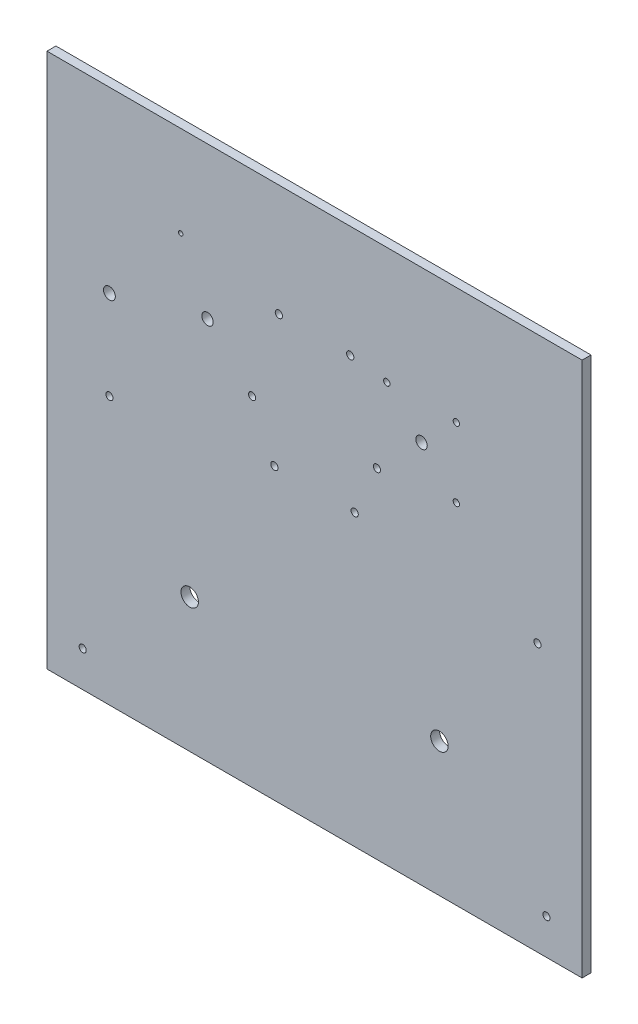
ISO-10303-21;
HEADER;
FILE_DESCRIPTION(('STEP AP214'),'2;1');
FILE_NAME('part.step','',(''),(''),'','','');
FILE_SCHEMA(('AUTOMOTIVE_DESIGN { 1 0 10303 214 1 1 1 1 }'));
ENDSEC;
DATA;
#1=APPLICATION_CONTEXT('core data for automotive mechanical design processes');
#2=APPLICATION_PROTOCOL_DEFINITION('international standard','automotive_design',2000,#1);
#3=PRODUCT_CONTEXT('',#1,'mechanical');
#4=PRODUCT('Part','Part','',(#3));
#5=PRODUCT_RELATED_PRODUCT_CATEGORY('part','',(#4));
#6=PRODUCT_DEFINITION_FORMATION('','',#4);
#7=PRODUCT_DEFINITION_CONTEXT('part definition',#1,'design');
#8=PRODUCT_DEFINITION('design','',#6,#7);
#9=PRODUCT_DEFINITION_SHAPE('','',#8);
#10=(LENGTH_UNIT() NAMED_UNIT(*) SI_UNIT(.MILLI.,.METRE.));
#11=(NAMED_UNIT(*) PLANE_ANGLE_UNIT() SI_UNIT($,.RADIAN.));
#12=(NAMED_UNIT(*) SI_UNIT($,.STERADIAN.) SOLID_ANGLE_UNIT());
#13=UNCERTAINTY_MEASURE_WITH_UNIT(LENGTH_MEASURE(1.E-05),#10,'distance_accuracy_value','');
#14=(GEOMETRIC_REPRESENTATION_CONTEXT(3) GLOBAL_UNCERTAINTY_ASSIGNED_CONTEXT((#13)) GLOBAL_UNIT_ASSIGNED_CONTEXT((#10,
#11,#12)) REPRESENTATION_CONTEXT('',''));
#15=CARTESIAN_POINT('',(0.,0.,0.));
#16=DIRECTION('',(0.,0.,1.));
#17=DIRECTION('',(1.,0.,0.));
#18=AXIS2_PLACEMENT_3D('',#15,#16,#17);
#19=CARTESIAN_POINT('',(190.5,0.,6.35));
#20=DIRECTION('',(0.,0.,1.));
#21=DIRECTION('',(1.,0.,0.));
#22=AXIS2_PLACEMENT_3D('',#19,#20,#21);
#23=PLANE('',#22);
#24=CARTESIAN_POINT('',(-146.05,254.,6.35));
#25=DIRECTION('',(0.,0.,1.));
#26=DIRECTION('',(1.,0.,0.));
#27=AXIS2_PLACEMENT_3D('',#24,#25,#26);
#28=CIRCLE('',#27,4.21639999999998);
#29=CARTESIAN_POINT('',(-141.8336,254.,6.35));
#30=VERTEX_POINT('',#29);
#31=EDGE_CURVE('E224',#30,#30,#28,.T.);
#32=ORIENTED_EDGE('',*,*,#31,.F.);
#33=EDGE_LOOP('',(#32));
#34=FACE_BOUND('',#33,.T.);
#35=CARTESIAN_POINT('',(-95.25,316.23,6.35));
#36=DIRECTION('',(0.,0.,1.));
#37=DIRECTION('',(1.,0.,0.));
#38=AXIS2_PLACEMENT_3D('',#35,#36,#37);
#39=CIRCLE('',#38,1.5875);
#40=CARTESIAN_POINT('',(-93.6625,316.23,6.35));
#41=VERTEX_POINT('',#40);
#42=EDGE_CURVE('E207',#41,#41,#39,.T.);
#43=ORIENTED_EDGE('',*,*,#42,.F.);
#44=EDGE_LOOP('',(#43));
#45=FACE_BOUND('',#44,.T.);
#46=CARTESIAN_POINT('',(-28.575,206.114999999996,6.35));
#47=DIRECTION('',(0.,0.,1.));
#48=DIRECTION('',(1.,0.,0.));
#49=AXIS2_PLACEMENT_3D('',#46,#47,#48);
#50=CIRCLE('',#49,2.57968749999999);
#51=CARTESIAN_POINT('',(-25.9953125,206.114999999996,6.35));
#52=VERTEX_POINT('',#51);
#53=EDGE_CURVE('E195',#52,#52,#50,.T.);
#54=ORIENTED_EDGE('',*,*,#53,.F.);
#55=EDGE_LOOP('',(#54));
#56=FACE_BOUND('',#55,.T.);
#57=CARTESIAN_POINT('',(-44.45,241.3,6.35));
#58=DIRECTION('',(0.,0.,1.));
#59=DIRECTION('',(-1.,0.,0.));
#60=AXIS2_PLACEMENT_3D('',#57,#58,#59);
#61=CIRCLE('',#60,2.54000000000002);
#62=CARTESIAN_POINT('',(-46.99,241.3,6.35));
#63=VERTEX_POINT('',#62);
#64=EDGE_CURVE('E183',#63,#63,#61,.T.);
#65=ORIENTED_EDGE('',*,*,#64,.F.);
#66=EDGE_LOOP('',(#65));
#67=FACE_BOUND('',#66,.T.);
#68=CARTESIAN_POINT('',(-146.05,190.5,6.35));
#69=DIRECTION('',(0.,0.,1.));
#70=DIRECTION('',(-1.,0.,0.));
#71=AXIS2_PLACEMENT_3D('',#68,#69,#70);
#72=CIRCLE('',#71,2.53999999999995);
#73=CARTESIAN_POINT('',(-148.59,190.5,6.35));
#74=VERTEX_POINT('',#73);
#75=EDGE_CURVE('E171',#74,#74,#72,.T.);
#76=ORIENTED_EDGE('',*,*,#75,.F.);
#77=EDGE_LOOP('',(#76));
#78=FACE_BOUND('',#77,.T.);
#79=CARTESIAN_POINT('',(158.75,190.5,6.35));
#80=DIRECTION('',(0.,0.,1.));
#81=DIRECTION('',(1.,0.,0.));
#82=AXIS2_PLACEMENT_3D('',#79,#80,#81);
#83=CIRCLE('',#82,2.53999999999998);
#84=CARTESIAN_POINT('',(161.29,190.5,6.35));
#85=VERTEX_POINT('',#84);
#86=EDGE_CURVE('E159',#85,#85,#83,.T.);
#87=ORIENTED_EDGE('',*,*,#86,.F.);
#88=EDGE_LOOP('',(#87));
#89=FACE_BOUND('',#88,.T.);
#90=CARTESIAN_POINT('',(-165.1,25.3999999999985,6.35));
#91=DIRECTION('',(0.,0.,1.));
#92=DIRECTION('',(-1.,0.,0.));
#93=AXIS2_PLACEMENT_3D('',#90,#91,#92);
#94=CIRCLE('',#93,2.53999999999998);
#95=CARTESIAN_POINT('',(-167.64,25.3999999999985,6.35));
#96=VERTEX_POINT('',#95);
#97=EDGE_CURVE('E147',#96,#96,#94,.T.);
#98=ORIENTED_EDGE('',*,*,#97,.F.);
#99=EDGE_LOOP('',(#98));
#100=FACE_BOUND('',#99,.T.);
#101=CARTESIAN_POINT('',(88.9000000000001,95.2499999999999,6.35));
#102=DIRECTION('',(0.,0.,1.));
#103=DIRECTION('',(1.,0.,0.));
#104=AXIS2_PLACEMENT_3D('',#101,#102,#103);
#105=CIRCLE('',#104,6.22299999999999);
#106=CARTESIAN_POINT('',(95.1230000000001,95.2499999999999,6.35));
#107=VERTEX_POINT('',#106);
#108=EDGE_CURVE('E135',#107,#107,#105,.T.);
#109=ORIENTED_EDGE('',*,*,#108,.F.);
#110=EDGE_LOOP('',(#109));
#111=FACE_BOUND('',#110,.T.);
#112=CARTESIAN_POINT('',(100.948737341529,297.798737341529,6.35));
#113=DIRECTION('',(0.,0.,1.));
#114=DIRECTION('',(1.,0.,0.));
#115=AXIS2_PLACEMENT_3D('',#112,#113,#114);
#116=CIRCLE('',#115,2.25);
#117=CARTESIAN_POINT('',(103.198737341529,297.798737341529,6.35));
#118=VERTEX_POINT('',#117);
#119=EDGE_CURVE('E123',#118,#118,#116,.T.);
#120=ORIENTED_EDGE('',*,*,#119,.F.);
#121=EDGE_LOOP('',(#120));
#122=FACE_BOUND('',#121,.T.);
#123=CARTESIAN_POINT('',(-25.4,301.364999999996,6.35));
#124=DIRECTION('',(0.,0.,1.));
#125=DIRECTION('',(1.,0.,0.));
#126=AXIS2_PLACEMENT_3D('',#123,#124,#125);
#127=CIRCLE('',#126,2.5796875);
#128=CARTESIAN_POINT('',(-22.8203125,301.364999999996,6.35));
#129=VERTEX_POINT('',#128);
#130=EDGE_CURVE('E102',#129,#129,#127,.T.);
#131=ORIENTED_EDGE('',*,*,#130,.F.);
#132=EDGE_LOOP('',(#131));
#133=FACE_BOUND('',#132,.T.);
#134=DIRECTION('',(0.,1.,0.));
#135=VECTOR('',#134,1.);
#136=CARTESIAN_POINT('',(190.5,381.,6.35));
#137=LINE('',#136,#135);
#138=CARTESIAN_POINT('',(190.5,0.,6.35));
#139=VERTEX_POINT('',#138);
#140=CARTESIAN_POINT('',(190.5,381.,6.35));
#141=VERTEX_POINT('',#140);
#142=EDGE_CURVE('E87',#139,#141,#137,.T.);
#143=ORIENTED_EDGE('',*,*,#142,.T.);
#144=DIRECTION('',(-1.,0.,0.));
#145=VECTOR('',#144,1.);
#146=CARTESIAN_POINT('',(190.5,381.,6.35));
#147=LINE('',#146,#145);
#148=CARTESIAN_POINT('',(-190.5,381.,6.35));
#149=VERTEX_POINT('',#148);
#150=EDGE_CURVE('E82',#141,#149,#147,.T.);
#151=ORIENTED_EDGE('',*,*,#150,.T.);
#152=DIRECTION('',(0.,-1.,0.));
#153=VECTOR('',#152,1.);
#154=CARTESIAN_POINT('',(-190.5,381.,6.35));
#155=LINE('',#154,#153);
#156=CARTESIAN_POINT('',(-190.5,0.,6.35));
#157=VERTEX_POINT('',#156);
#158=EDGE_CURVE('E85',#149,#157,#155,.T.);
#159=ORIENTED_EDGE('',*,*,#158,.T.);
#160=DIRECTION('',(1.,0.,0.));
#161=VECTOR('',#160,1.);
#162=CARTESIAN_POINT('',(-190.5,0.,6.35));
#163=LINE('',#162,#161);
#164=EDGE_CURVE('E52',#157,#139,#163,.T.);
#165=ORIENTED_EDGE('',*,*,#164,.T.);
#166=EDGE_LOOP('',(#143,#151,#159,#165));
#167=FACE_BOUND('',#166,.T.);
#168=CARTESIAN_POINT('',(25.4,301.364999999996,6.35));
#169=DIRECTION('',(0.,0.,1.));
#170=DIRECTION('',(1.,0.,0.));
#171=AXIS2_PLACEMENT_3D('',#168,#169,#170);
#172=CIRCLE('',#171,2.57968749999999);
#173=CARTESIAN_POINT('',(27.9796875,301.364999999996,6.35));
#174=VERTEX_POINT('',#173);
#175=EDGE_CURVE('E117',#174,#174,#172,.T.);
#176=ORIENTED_EDGE('',*,*,#175,.F.);
#177=EDGE_LOOP('',(#176));
#178=FACE_BOUND('',#177,.T.);
#179=CARTESIAN_POINT('',(76.1999999999998,273.05,6.35));
#180=DIRECTION('',(0.,0.,1.));
#181=DIRECTION('',(1.,0.,0.));
#182=AXIS2_PLACEMENT_3D('',#179,#180,#181);
#183=CIRCLE('',#182,4.06400000000001);
#184=CARTESIAN_POINT('',(80.2639999999998,273.05,6.35));
#185=VERTEX_POINT('',#184);
#186=EDGE_CURVE('E129',#185,#185,#183,.T.);
#187=ORIENTED_EDGE('',*,*,#186,.F.);
#188=EDGE_LOOP('',(#187));
#189=FACE_BOUND('',#188,.T.);
#190=CARTESIAN_POINT('',(44.4500000000001,241.3,6.35));
#191=DIRECTION('',(0.,0.,1.));
#192=DIRECTION('',(1.,0.,0.));
#193=AXIS2_PLACEMENT_3D('',#190,#191,#192);
#194=CIRCLE('',#193,2.54000000000002);
#195=CARTESIAN_POINT('',(46.9900000000001,241.3,6.35));
#196=VERTEX_POINT('',#195);
#197=EDGE_CURVE('E141',#196,#196,#194,.T.);
#198=ORIENTED_EDGE('',*,*,#197,.F.);
#199=EDGE_LOOP('',(#198));
#200=FACE_BOUND('',#199,.T.);
#201=CARTESIAN_POINT('',(165.1,25.3999999999986,6.35));
#202=DIRECTION('',(0.,0.,1.));
#203=DIRECTION('',(1.,0.,0.));
#204=AXIS2_PLACEMENT_3D('',#201,#202,#203);
#205=CIRCLE('',#204,2.53999999999998);
#206=CARTESIAN_POINT('',(167.64,25.3999999999986,6.35));
#207=VERTEX_POINT('',#206);
#208=EDGE_CURVE('E153',#207,#207,#205,.T.);
#209=ORIENTED_EDGE('',*,*,#208,.F.);
#210=EDGE_LOOP('',(#209));
#211=FACE_BOUND('',#210,.T.);
#212=CARTESIAN_POINT('',(-88.9,95.2499999999999,6.35));
#213=DIRECTION('',(0.,0.,1.));
#214=DIRECTION('',(-1.,0.,0.));
#215=AXIS2_PLACEMENT_3D('',#212,#213,#214);
#216=CIRCLE('',#215,6.22299999999999);
#217=CARTESIAN_POINT('',(-95.123,95.2499999999999,6.35));
#218=VERTEX_POINT('',#217);
#219=EDGE_CURVE('E165',#218,#218,#216,.T.);
#220=ORIENTED_EDGE('',*,*,#219,.F.);
#221=EDGE_LOOP('',(#220));
#222=FACE_BOUND('',#221,.T.);
#223=CARTESIAN_POINT('',(51.4512626584706,297.798737341528,6.35));
#224=DIRECTION('',(0.,0.,1.));
#225=DIRECTION('',(1.,0.,0.));
#226=AXIS2_PLACEMENT_3D('',#223,#224,#225);
#227=CIRCLE('',#226,2.25000000000001);
#228=CARTESIAN_POINT('',(53.7012626584706,297.798737341528,6.35));
#229=VERTEX_POINT('',#228);
#230=EDGE_CURVE('E177',#229,#229,#227,.T.);
#231=ORIENTED_EDGE('',*,*,#230,.F.);
#232=EDGE_LOOP('',(#231));
#233=FACE_BOUND('',#232,.T.);
#234=CARTESIAN_POINT('',(-76.2,273.05,6.35));
#235=DIRECTION('',(0.,0.,1.));
#236=DIRECTION('',(-1.,0.,0.));
#237=AXIS2_PLACEMENT_3D('',#234,#235,#236);
#238=CIRCLE('',#237,4.06400000000001);
#239=CARTESIAN_POINT('',(-80.264,273.05,6.35));
#240=VERTEX_POINT('',#239);
#241=EDGE_CURVE('E189',#240,#240,#238,.T.);
#242=ORIENTED_EDGE('',*,*,#241,.F.);
#243=EDGE_LOOP('',(#242));
#244=FACE_BOUND('',#243,.T.);
#245=CARTESIAN_POINT('',(28.575,206.114999999996,6.35));
#246=DIRECTION('',(0.,0.,1.));
#247=DIRECTION('',(1.,0.,0.));
#248=AXIS2_PLACEMENT_3D('',#245,#246,#247);
#249=CIRCLE('',#248,2.57968749999999);
#250=CARTESIAN_POINT('',(31.1546875,206.114999999996,6.35));
#251=VERTEX_POINT('',#250);
#252=EDGE_CURVE('E201',#251,#251,#249,.T.);
#253=ORIENTED_EDGE('',*,*,#252,.F.);
#254=EDGE_LOOP('',(#253));
#255=FACE_BOUND('',#254,.T.);
#256=CARTESIAN_POINT('',(100.94873734153,248.301262658471,6.35));
#257=DIRECTION('',(0.,0.,1.));
#258=DIRECTION('',(1.,0.,0.));
#259=AXIS2_PLACEMENT_3D('',#256,#257,#258);
#260=CIRCLE('',#259,2.24999999999998);
#261=CARTESIAN_POINT('',(103.19873734153,248.301262658471,6.35));
#262=VERTEX_POINT('',#261);
#263=EDGE_CURVE('E213',#262,#262,#260,.T.);
#264=ORIENTED_EDGE('',*,*,#263,.F.);
#265=EDGE_LOOP('',(#264));
#266=FACE_BOUND('',#265,.T.);
#267=ADVANCED_FACE('F35',(#34,#45,#56,#67,#78,#89,#100,#111,#122,#133,#167,#178,#189,#200,#211,
#222,#233,#244,#255,#266),#23,.T.);
#268=CARTESIAN_POINT('',(190.5,0.,0.));
#269=DIRECTION('',(0.,0.,1.));
#270=DIRECTION('',(1.,0.,0.));
#271=AXIS2_PLACEMENT_3D('',#268,#269,#270);
#272=PLANE('',#271);
#273=CARTESIAN_POINT('',(-146.05,254.,0.));
#274=DIRECTION('',(0.,0.,1.));
#275=DIRECTION('',(1.,0.,0.));
#276=AXIS2_PLACEMENT_3D('',#273,#274,#275);
#277=CIRCLE('',#276,4.21640000000001);
#278=CARTESIAN_POINT('',(-141.8336,254.,0.));
#279=VERTEX_POINT('',#278);
#280=EDGE_CURVE('E219',#279,#279,#277,.T.);
#281=ORIENTED_EDGE('',*,*,#280,.T.);
#282=EDGE_LOOP('',(#281));
#283=FACE_BOUND('',#282,.T.);
#284=CARTESIAN_POINT('',(-95.25,316.23,0.));
#285=DIRECTION('',(0.,0.,1.));
#286=DIRECTION('',(1.,0.,0.));
#287=AXIS2_PLACEMENT_3D('',#284,#285,#286);
#288=CIRCLE('',#287,1.5875);
#289=CARTESIAN_POINT('',(-93.6625,316.23,0.));
#290=VERTEX_POINT('',#289);
#291=EDGE_CURVE('E210',#290,#290,#288,.T.);
#292=ORIENTED_EDGE('',*,*,#291,.T.);
#293=EDGE_LOOP('',(#292));
#294=FACE_BOUND('',#293,.T.);
#295=CARTESIAN_POINT('',(-28.575,206.114999999996,0.));
#296=DIRECTION('',(0.,0.,1.));
#297=DIRECTION('',(1.,0.,0.));
#298=AXIS2_PLACEMENT_3D('',#295,#296,#297);
#299=CIRCLE('',#298,2.57968749999999);
#300=CARTESIAN_POINT('',(-25.9953125,206.114999999996,0.));
#301=VERTEX_POINT('',#300);
#302=EDGE_CURVE('E198',#301,#301,#299,.T.);
#303=ORIENTED_EDGE('',*,*,#302,.T.);
#304=EDGE_LOOP('',(#303));
#305=FACE_BOUND('',#304,.T.);
#306=CARTESIAN_POINT('',(-44.45,241.3,0.));
#307=DIRECTION('',(0.,0.,1.));
#308=DIRECTION('',(-1.,0.,0.));
#309=AXIS2_PLACEMENT_3D('',#306,#307,#308);
#310=CIRCLE('',#309,2.54000000000002);
#311=CARTESIAN_POINT('',(-46.99,241.3,0.));
#312=VERTEX_POINT('',#311);
#313=EDGE_CURVE('E186',#312,#312,#310,.T.);
#314=ORIENTED_EDGE('',*,*,#313,.T.);
#315=EDGE_LOOP('',(#314));
#316=FACE_BOUND('',#315,.T.);
#317=CARTESIAN_POINT('',(-146.05,190.5,0.));
#318=DIRECTION('',(0.,0.,1.));
#319=DIRECTION('',(-1.,0.,0.));
#320=AXIS2_PLACEMENT_3D('',#317,#318,#319);
#321=CIRCLE('',#320,2.53999999999995);
#322=CARTESIAN_POINT('',(-148.59,190.5,0.));
#323=VERTEX_POINT('',#322);
#324=EDGE_CURVE('E174',#323,#323,#321,.T.);
#325=ORIENTED_EDGE('',*,*,#324,.T.);
#326=EDGE_LOOP('',(#325));
#327=FACE_BOUND('',#326,.T.);
#328=CARTESIAN_POINT('',(158.75,190.5,0.));
#329=DIRECTION('',(0.,0.,1.));
#330=DIRECTION('',(1.,0.,0.));
#331=AXIS2_PLACEMENT_3D('',#328,#329,#330);
#332=CIRCLE('',#331,2.53999999999998);
#333=CARTESIAN_POINT('',(161.29,190.5,0.));
#334=VERTEX_POINT('',#333);
#335=EDGE_CURVE('E162',#334,#334,#332,.T.);
#336=ORIENTED_EDGE('',*,*,#335,.T.);
#337=EDGE_LOOP('',(#336));
#338=FACE_BOUND('',#337,.T.);
#339=CARTESIAN_POINT('',(-165.1,25.3999999999985,0.));
#340=DIRECTION('',(0.,0.,1.));
#341=DIRECTION('',(-1.,0.,0.));
#342=AXIS2_PLACEMENT_3D('',#339,#340,#341);
#343=CIRCLE('',#342,2.53999999999998);
#344=CARTESIAN_POINT('',(-167.64,25.3999999999985,0.));
#345=VERTEX_POINT('',#344);
#346=EDGE_CURVE('E150',#345,#345,#343,.T.);
#347=ORIENTED_EDGE('',*,*,#346,.T.);
#348=EDGE_LOOP('',(#347));
#349=FACE_BOUND('',#348,.T.);
#350=CARTESIAN_POINT('',(88.9000000000001,95.2499999999999,0.));
#351=DIRECTION('',(0.,0.,1.));
#352=DIRECTION('',(1.,0.,0.));
#353=AXIS2_PLACEMENT_3D('',#350,#351,#352);
#354=CIRCLE('',#353,6.22299999999999);
#355=CARTESIAN_POINT('',(95.1230000000001,95.2499999999999,0.));
#356=VERTEX_POINT('',#355);
#357=EDGE_CURVE('E138',#356,#356,#354,.T.);
#358=ORIENTED_EDGE('',*,*,#357,.T.);
#359=EDGE_LOOP('',(#358));
#360=FACE_BOUND('',#359,.T.);
#361=CARTESIAN_POINT('',(100.948737341529,297.798737341529,0.));
#362=DIRECTION('',(0.,0.,1.));
#363=DIRECTION('',(1.,0.,0.));
#364=AXIS2_PLACEMENT_3D('',#361,#362,#363);
#365=CIRCLE('',#364,2.25);
#366=CARTESIAN_POINT('',(103.198737341529,297.798737341529,0.));
#367=VERTEX_POINT('',#366);
#368=EDGE_CURVE('E126',#367,#367,#365,.T.);
#369=ORIENTED_EDGE('',*,*,#368,.T.);
#370=EDGE_LOOP('',(#369));
#371=FACE_BOUND('',#370,.T.);
#372=CARTESIAN_POINT('',(-25.4,301.364999999996,0.));
#373=DIRECTION('',(0.,0.,1.));
#374=DIRECTION('',(1.,0.,0.));
#375=AXIS2_PLACEMENT_3D('',#372,#373,#374);
#376=CIRCLE('',#375,2.5796875);
#377=CARTESIAN_POINT('',(-22.8203125,301.364999999996,0.));
#378=VERTEX_POINT('',#377);
#379=EDGE_CURVE('E114',#378,#378,#376,.T.);
#380=ORIENTED_EDGE('',*,*,#379,.T.);
#381=EDGE_LOOP('',(#380));
#382=FACE_BOUND('',#381,.T.);
#383=DIRECTION('',(0.,1.,0.));
#384=VECTOR('',#383,1.);
#385=CARTESIAN_POINT('',(190.5,381.,0.));
#386=LINE('',#385,#384);
#387=CARTESIAN_POINT('',(190.5,0.,0.));
#388=VERTEX_POINT('',#387);
#389=CARTESIAN_POINT('',(190.5,381.,0.));
#390=VERTEX_POINT('',#389);
#391=EDGE_CURVE('E99',#388,#390,#386,.T.);
#392=ORIENTED_EDGE('',*,*,#391,.F.);
#393=DIRECTION('',(1.,0.,0.));
#394=VECTOR('',#393,1.);
#395=CARTESIAN_POINT('',(-190.5,0.,0.));
#396=LINE('',#395,#394);
#397=CARTESIAN_POINT('',(-190.5,0.,0.));
#398=VERTEX_POINT('',#397);
#399=EDGE_CURVE('E75',#398,#388,#396,.T.);
#400=ORIENTED_EDGE('',*,*,#399,.F.);
#401=DIRECTION('',(0.,-1.,0.));
#402=VECTOR('',#401,1.);
#403=CARTESIAN_POINT('',(-190.5,381.,0.));
#404=LINE('',#403,#402);
#405=CARTESIAN_POINT('',(-190.5,381.,0.));
#406=VERTEX_POINT('',#405);
#407=EDGE_CURVE('E69',#406,#398,#404,.T.);
#408=ORIENTED_EDGE('',*,*,#407,.F.);
#409=DIRECTION('',(-1.,0.,0.));
#410=VECTOR('',#409,1.);
#411=CARTESIAN_POINT('',(190.5,381.,0.));
#412=LINE('',#411,#410);
#413=EDGE_CURVE('E91',#390,#406,#412,.T.);
#414=ORIENTED_EDGE('',*,*,#413,.F.);
#415=EDGE_LOOP('',(#392,#400,#408,#414));
#416=FACE_BOUND('',#415,.T.);
#417=CARTESIAN_POINT('',(25.4,301.364999999996,0.));
#418=DIRECTION('',(0.,0.,1.));
#419=DIRECTION('',(1.,0.,0.));
#420=AXIS2_PLACEMENT_3D('',#417,#418,#419);
#421=CIRCLE('',#420,2.57968749999999);
#422=CARTESIAN_POINT('',(27.9796875,301.364999999996,0.));
#423=VERTEX_POINT('',#422);
#424=EDGE_CURVE('E120',#423,#423,#421,.T.);
#425=ORIENTED_EDGE('',*,*,#424,.T.);
#426=EDGE_LOOP('',(#425));
#427=FACE_BOUND('',#426,.T.);
#428=CARTESIAN_POINT('',(76.1999999999998,273.05,0.));
#429=DIRECTION('',(0.,0.,1.));
#430=DIRECTION('',(1.,0.,0.));
#431=AXIS2_PLACEMENT_3D('',#428,#429,#430);
#432=CIRCLE('',#431,4.06400000000001);
#433=CARTESIAN_POINT('',(80.2639999999998,273.05,0.));
#434=VERTEX_POINT('',#433);
#435=EDGE_CURVE('E132',#434,#434,#432,.T.);
#436=ORIENTED_EDGE('',*,*,#435,.T.);
#437=EDGE_LOOP('',(#436));
#438=FACE_BOUND('',#437,.T.);
#439=CARTESIAN_POINT('',(44.4500000000001,241.3,0.));
#440=DIRECTION('',(0.,0.,1.));
#441=DIRECTION('',(1.,0.,0.));
#442=AXIS2_PLACEMENT_3D('',#439,#440,#441);
#443=CIRCLE('',#442,2.54000000000002);
#444=CARTESIAN_POINT('',(46.9900000000001,241.3,0.));
#445=VERTEX_POINT('',#444);
#446=EDGE_CURVE('E144',#445,#445,#443,.T.);
#447=ORIENTED_EDGE('',*,*,#446,.T.);
#448=EDGE_LOOP('',(#447));
#449=FACE_BOUND('',#448,.T.);
#450=CARTESIAN_POINT('',(165.1,25.3999999999986,0.));
#451=DIRECTION('',(0.,0.,1.));
#452=DIRECTION('',(1.,0.,0.));
#453=AXIS2_PLACEMENT_3D('',#450,#451,#452);
#454=CIRCLE('',#453,2.53999999999998);
#455=CARTESIAN_POINT('',(167.64,25.3999999999986,0.));
#456=VERTEX_POINT('',#455);
#457=EDGE_CURVE('E156',#456,#456,#454,.T.);
#458=ORIENTED_EDGE('',*,*,#457,.T.);
#459=EDGE_LOOP('',(#458));
#460=FACE_BOUND('',#459,.T.);
#461=CARTESIAN_POINT('',(-88.9,95.2499999999999,0.));
#462=DIRECTION('',(0.,0.,1.));
#463=DIRECTION('',(-1.,0.,0.));
#464=AXIS2_PLACEMENT_3D('',#461,#462,#463);
#465=CIRCLE('',#464,6.22299999999999);
#466=CARTESIAN_POINT('',(-95.123,95.2499999999999,0.));
#467=VERTEX_POINT('',#466);
#468=EDGE_CURVE('E168',#467,#467,#465,.T.);
#469=ORIENTED_EDGE('',*,*,#468,.T.);
#470=EDGE_LOOP('',(#469));
#471=FACE_BOUND('',#470,.T.);
#472=CARTESIAN_POINT('',(51.4512626584706,297.798737341528,0.));
#473=DIRECTION('',(0.,0.,1.));
#474=DIRECTION('',(1.,0.,0.));
#475=AXIS2_PLACEMENT_3D('',#472,#473,#474);
#476=CIRCLE('',#475,2.25000000000001);
#477=CARTESIAN_POINT('',(53.7012626584706,297.798737341528,0.));
#478=VERTEX_POINT('',#477);
#479=EDGE_CURVE('E180',#478,#478,#476,.T.);
#480=ORIENTED_EDGE('',*,*,#479,.T.);
#481=EDGE_LOOP('',(#480));
#482=FACE_BOUND('',#481,.T.);
#483=CARTESIAN_POINT('',(-76.2,273.05,0.));
#484=DIRECTION('',(0.,0.,1.));
#485=DIRECTION('',(-1.,0.,0.));
#486=AXIS2_PLACEMENT_3D('',#483,#484,#485);
#487=CIRCLE('',#486,4.06400000000001);
#488=CARTESIAN_POINT('',(-80.264,273.05,0.));
#489=VERTEX_POINT('',#488);
#490=EDGE_CURVE('E192',#489,#489,#487,.T.);
#491=ORIENTED_EDGE('',*,*,#490,.T.);
#492=EDGE_LOOP('',(#491));
#493=FACE_BOUND('',#492,.T.);
#494=CARTESIAN_POINT('',(28.575,206.114999999996,0.));
#495=DIRECTION('',(0.,0.,1.));
#496=DIRECTION('',(1.,0.,0.));
#497=AXIS2_PLACEMENT_3D('',#494,#495,#496);
#498=CIRCLE('',#497,2.57968749999999);
#499=CARTESIAN_POINT('',(31.1546875,206.114999999996,0.));
#500=VERTEX_POINT('',#499);
#501=EDGE_CURVE('E204',#500,#500,#498,.T.);
#502=ORIENTED_EDGE('',*,*,#501,.T.);
#503=EDGE_LOOP('',(#502));
#504=FACE_BOUND('',#503,.T.);
#505=CARTESIAN_POINT('',(100.94873734153,248.301262658471,0.));
#506=DIRECTION('',(0.,0.,1.));
#507=DIRECTION('',(1.,0.,0.));
#508=AXIS2_PLACEMENT_3D('',#505,#506,#507);
#509=CIRCLE('',#508,2.24999999999998);
#510=CARTESIAN_POINT('',(103.19873734153,248.301262658471,0.));
#511=VERTEX_POINT('',#510);
#512=EDGE_CURVE('E216',#511,#511,#509,.T.);
#513=ORIENTED_EDGE('',*,*,#512,.T.);
#514=EDGE_LOOP('',(#513));
#515=FACE_BOUND('',#514,.T.);
#516=ADVANCED_FACE('F110',(#283,#294,#305,#316,#327,#338,#349,#360,#371,#382,#416,#427,#438,
#449,#460,#471,#482,#493,#504,#515),#272,.F.);
#517=CARTESIAN_POINT('',(190.5,381.,6.35));
#518=DIRECTION('',(-1.,0.,0.));
#519=DIRECTION('',(0.,-1.,0.));
#520=AXIS2_PLACEMENT_3D('',#517,#518,#519);
#521=PLANE('',#520);
#522=ORIENTED_EDGE('',*,*,#391,.T.);
#523=DIRECTION('',(0.,0.,-1.));
#524=VECTOR('',#523,1.);
#525=CARTESIAN_POINT('',(190.5,381.,6.35));
#526=LINE('',#525,#524);
#527=EDGE_CURVE('E11',#141,#390,#526,.T.);
#528=ORIENTED_EDGE('',*,*,#527,.F.);
#529=ORIENTED_EDGE('',*,*,#142,.F.);
#530=DIRECTION('',(0.,0.,-1.));
#531=VECTOR('',#530,1.);
#532=CARTESIAN_POINT('',(190.5,0.,6.35));
#533=LINE('',#532,#531);
#534=EDGE_CURVE('E95',#139,#388,#533,.T.);
#535=ORIENTED_EDGE('',*,*,#534,.T.);
#536=EDGE_LOOP('',(#522,#528,#529,#535));
#537=FACE_BOUND('',#536,.T.);
#538=ADVANCED_FACE('F37',(#537),#521,.F.);
#539=CARTESIAN_POINT('',(190.5,381.,6.35));
#540=DIRECTION('',(0.,-1.,0.));
#541=DIRECTION('',(1.,0.,0.));
#542=AXIS2_PLACEMENT_3D('',#539,#540,#541);
#543=PLANE('',#542);
#544=ORIENTED_EDGE('',*,*,#413,.T.);
#545=DIRECTION('',(0.,0.,-1.));
#546=VECTOR('',#545,1.);
#547=CARTESIAN_POINT('',(-190.5,381.,6.35));
#548=LINE('',#547,#546);
#549=EDGE_CURVE('E44',#149,#406,#548,.T.);
#550=ORIENTED_EDGE('',*,*,#549,.F.);
#551=ORIENTED_EDGE('',*,*,#150,.F.);
#552=ORIENTED_EDGE('',*,*,#527,.T.);
#553=EDGE_LOOP('',(#544,#550,#551,#552));
#554=FACE_BOUND('',#553,.T.);
#555=ADVANCED_FACE('F90',(#554),#543,.F.);
#556=CARTESIAN_POINT('',(-190.5,381.,6.35));
#557=DIRECTION('',(1.,0.,0.));
#558=DIRECTION('',(0.,1.,0.));
#559=AXIS2_PLACEMENT_3D('',#556,#557,#558);
#560=PLANE('',#559);
#561=ORIENTED_EDGE('',*,*,#407,.T.);
#562=DIRECTION('',(0.,0.,-1.));
#563=VECTOR('',#562,1.);
#564=CARTESIAN_POINT('',(-190.5,0.,6.35));
#565=LINE('',#564,#563);
#566=EDGE_CURVE('E92',#157,#398,#565,.T.);
#567=ORIENTED_EDGE('',*,*,#566,.F.);
#568=ORIENTED_EDGE('',*,*,#158,.F.);
#569=ORIENTED_EDGE('',*,*,#549,.T.);
#570=EDGE_LOOP('',(#561,#567,#568,#569));
#571=FACE_BOUND('',#570,.T.);
#572=ADVANCED_FACE('F93',(#571),#560,.F.);
#573=CARTESIAN_POINT('',(-190.5,0.,6.35));
#574=DIRECTION('',(0.,1.,0.));
#575=DIRECTION('',(0.,0.,1.));
#576=AXIS2_PLACEMENT_3D('',#573,#574,#575);
#577=PLANE('',#576);
#578=ORIENTED_EDGE('',*,*,#399,.T.);
#579=ORIENTED_EDGE('',*,*,#534,.F.);
#580=ORIENTED_EDGE('',*,*,#164,.F.);
#581=ORIENTED_EDGE('',*,*,#566,.T.);
#582=EDGE_LOOP('',(#578,#579,#580,#581));
#583=FACE_BOUND('',#582,.T.);
#584=ADVANCED_FACE('F107',(#583),#577,.F.);
#585=CARTESIAN_POINT('',(-25.4,301.364999999996,6.35));
#586=DIRECTION('',(0.,0.,-1.));
#587=DIRECTION('',(-1.,0.,0.));
#588=AXIS2_PLACEMENT_3D('',#585,#586,#587);
#589=CYLINDRICAL_SURFACE('',#588,2.5796875);
#590=ORIENTED_EDGE('',*,*,#130,.T.);
#591=EDGE_LOOP('',(#590));
#592=FACE_BOUND('',#591,.T.);
#593=ORIENTED_EDGE('',*,*,#379,.F.);
#594=EDGE_LOOP('',(#593));
#595=FACE_BOUND('',#594,.T.);
#596=ADVANCED_FACE('F251',(#592,#595),#589,.F.);
#597=CARTESIAN_POINT('',(25.4,301.364999999996,6.35));
#598=DIRECTION('',(0.,0.,-1.));
#599=DIRECTION('',(-1.,0.,0.));
#600=AXIS2_PLACEMENT_3D('',#597,#598,#599);
#601=CYLINDRICAL_SURFACE('',#600,2.57968749999999);
#602=ORIENTED_EDGE('',*,*,#175,.T.);
#603=EDGE_LOOP('',(#602));
#604=FACE_BOUND('',#603,.T.);
#605=ORIENTED_EDGE('',*,*,#424,.F.);
#606=EDGE_LOOP('',(#605));
#607=FACE_BOUND('',#606,.T.);
#608=ADVANCED_FACE('F254',(#604,#607),#601,.F.);
#609=CARTESIAN_POINT('',(100.948737341529,297.798737341529,6.35));
#610=DIRECTION('',(0.,0.,-1.));
#611=DIRECTION('',(-1.,0.,0.));
#612=AXIS2_PLACEMENT_3D('',#609,#610,#611);
#613=CYLINDRICAL_SURFACE('',#612,2.25);
#614=ORIENTED_EDGE('',*,*,#119,.T.);
#615=EDGE_LOOP('',(#614));
#616=FACE_BOUND('',#615,.T.);
#617=ORIENTED_EDGE('',*,*,#368,.F.);
#618=EDGE_LOOP('',(#617));
#619=FACE_BOUND('',#618,.T.);
#620=ADVANCED_FACE('F292',(#616,#619),#613,.F.);
#621=CARTESIAN_POINT('',(76.1999999999998,273.05,6.35));
#622=DIRECTION('',(0.,0.,-1.));
#623=DIRECTION('',(-1.,0.,0.));
#624=AXIS2_PLACEMENT_3D('',#621,#622,#623);
#625=CYLINDRICAL_SURFACE('',#624,4.06400000000001);
#626=ORIENTED_EDGE('',*,*,#186,.T.);
#627=EDGE_LOOP('',(#626));
#628=FACE_BOUND('',#627,.T.);
#629=ORIENTED_EDGE('',*,*,#435,.F.);
#630=EDGE_LOOP('',(#629));
#631=FACE_BOUND('',#630,.T.);
#632=ADVANCED_FACE('F300',(#628,#631),#625,.F.);
#633=CARTESIAN_POINT('',(88.9000000000001,95.2499999999999,6.35));
#634=DIRECTION('',(0.,0.,-1.));
#635=DIRECTION('',(-1.,0.,0.));
#636=AXIS2_PLACEMENT_3D('',#633,#634,#635);
#637=CYLINDRICAL_SURFACE('',#636,6.22299999999999);
#638=ORIENTED_EDGE('',*,*,#108,.T.);
#639=EDGE_LOOP('',(#638));
#640=FACE_BOUND('',#639,.T.);
#641=ORIENTED_EDGE('',*,*,#357,.F.);
#642=EDGE_LOOP('',(#641));
#643=FACE_BOUND('',#642,.T.);
#644=ADVANCED_FACE('F308',(#640,#643),#637,.F.);
#645=CARTESIAN_POINT('',(44.4500000000001,241.3,6.35));
#646=DIRECTION('',(0.,0.,-1.));
#647=DIRECTION('',(-1.,0.,0.));
#648=AXIS2_PLACEMENT_3D('',#645,#646,#647);
#649=CYLINDRICAL_SURFACE('',#648,2.54000000000002);
#650=ORIENTED_EDGE('',*,*,#197,.T.);
#651=EDGE_LOOP('',(#650));
#652=FACE_BOUND('',#651,.T.);
#653=ORIENTED_EDGE('',*,*,#446,.F.);
#654=EDGE_LOOP('',(#653));
#655=FACE_BOUND('',#654,.T.);
#656=ADVANCED_FACE('F316',(#652,#655),#649,.F.);
#657=CARTESIAN_POINT('',(-165.1,25.3999999999985,6.35));
#658=DIRECTION('',(0.,0.,-1.));
#659=DIRECTION('',(-1.,0.,0.));
#660=AXIS2_PLACEMENT_3D('',#657,#658,#659);
#661=CYLINDRICAL_SURFACE('',#660,2.53999999999998);
#662=ORIENTED_EDGE('',*,*,#97,.T.);
#663=EDGE_LOOP('',(#662));
#664=FACE_BOUND('',#663,.T.);
#665=ORIENTED_EDGE('',*,*,#346,.F.);
#666=EDGE_LOOP('',(#665));
#667=FACE_BOUND('',#666,.T.);
#668=ADVANCED_FACE('F324',(#664,#667),#661,.F.);
#669=CARTESIAN_POINT('',(165.1,25.3999999999986,6.35));
#670=DIRECTION('',(0.,0.,-1.));
#671=DIRECTION('',(-1.,0.,0.));
#672=AXIS2_PLACEMENT_3D('',#669,#670,#671);
#673=CYLINDRICAL_SURFACE('',#672,2.53999999999998);
#674=ORIENTED_EDGE('',*,*,#208,.T.);
#675=EDGE_LOOP('',(#674));
#676=FACE_BOUND('',#675,.T.);
#677=ORIENTED_EDGE('',*,*,#457,.F.);
#678=EDGE_LOOP('',(#677));
#679=FACE_BOUND('',#678,.T.);
#680=ADVANCED_FACE('F332',(#676,#679),#673,.F.);
#681=CARTESIAN_POINT('',(158.75,190.5,6.35));
#682=DIRECTION('',(0.,0.,-1.));
#683=DIRECTION('',(-1.,0.,0.));
#684=AXIS2_PLACEMENT_3D('',#681,#682,#683);
#685=CYLINDRICAL_SURFACE('',#684,2.53999999999998);
#686=ORIENTED_EDGE('',*,*,#86,.T.);
#687=EDGE_LOOP('',(#686));
#688=FACE_BOUND('',#687,.T.);
#689=ORIENTED_EDGE('',*,*,#335,.F.);
#690=EDGE_LOOP('',(#689));
#691=FACE_BOUND('',#690,.T.);
#692=ADVANCED_FACE('F340',(#688,#691),#685,.F.);
#693=CARTESIAN_POINT('',(-88.9,95.2499999999999,6.35));
#694=DIRECTION('',(0.,0.,-1.));
#695=DIRECTION('',(-1.,0.,0.));
#696=AXIS2_PLACEMENT_3D('',#693,#694,#695);
#697=CYLINDRICAL_SURFACE('',#696,6.22299999999999);
#698=ORIENTED_EDGE('',*,*,#219,.T.);
#699=EDGE_LOOP('',(#698));
#700=FACE_BOUND('',#699,.T.);
#701=ORIENTED_EDGE('',*,*,#468,.F.);
#702=EDGE_LOOP('',(#701));
#703=FACE_BOUND('',#702,.T.);
#704=ADVANCED_FACE('F348',(#700,#703),#697,.F.);
#705=CARTESIAN_POINT('',(-146.05,190.5,6.35));
#706=DIRECTION('',(0.,0.,-1.));
#707=DIRECTION('',(-1.,0.,0.));
#708=AXIS2_PLACEMENT_3D('',#705,#706,#707);
#709=CYLINDRICAL_SURFACE('',#708,2.53999999999995);
#710=ORIENTED_EDGE('',*,*,#75,.T.);
#711=EDGE_LOOP('',(#710));
#712=FACE_BOUND('',#711,.T.);
#713=ORIENTED_EDGE('',*,*,#324,.F.);
#714=EDGE_LOOP('',(#713));
#715=FACE_BOUND('',#714,.T.);
#716=ADVANCED_FACE('F356',(#712,#715),#709,.F.);
#717=CARTESIAN_POINT('',(51.4512626584706,297.798737341528,6.35));
#718=DIRECTION('',(0.,0.,-1.));
#719=DIRECTION('',(-1.,0.,0.));
#720=AXIS2_PLACEMENT_3D('',#717,#718,#719);
#721=CYLINDRICAL_SURFACE('',#720,2.25000000000001);
#722=ORIENTED_EDGE('',*,*,#230,.T.);
#723=EDGE_LOOP('',(#722));
#724=FACE_BOUND('',#723,.T.);
#725=ORIENTED_EDGE('',*,*,#479,.F.);
#726=EDGE_LOOP('',(#725));
#727=FACE_BOUND('',#726,.T.);
#728=ADVANCED_FACE('F364',(#724,#727),#721,.F.);
#729=CARTESIAN_POINT('',(-44.45,241.3,6.35));
#730=DIRECTION('',(0.,0.,-1.));
#731=DIRECTION('',(-1.,0.,0.));
#732=AXIS2_PLACEMENT_3D('',#729,#730,#731);
#733=CYLINDRICAL_SURFACE('',#732,2.54000000000002);
#734=ORIENTED_EDGE('',*,*,#64,.T.);
#735=EDGE_LOOP('',(#734));
#736=FACE_BOUND('',#735,.T.);
#737=ORIENTED_EDGE('',*,*,#313,.F.);
#738=EDGE_LOOP('',(#737));
#739=FACE_BOUND('',#738,.T.);
#740=ADVANCED_FACE('F372',(#736,#739),#733,.F.);
#741=CARTESIAN_POINT('',(-76.2,273.05,6.35));
#742=DIRECTION('',(0.,0.,-1.));
#743=DIRECTION('',(-1.,0.,0.));
#744=AXIS2_PLACEMENT_3D('',#741,#742,#743);
#745=CYLINDRICAL_SURFACE('',#744,4.06400000000001);
#746=ORIENTED_EDGE('',*,*,#241,.T.);
#747=EDGE_LOOP('',(#746));
#748=FACE_BOUND('',#747,.T.);
#749=ORIENTED_EDGE('',*,*,#490,.F.);
#750=EDGE_LOOP('',(#749));
#751=FACE_BOUND('',#750,.T.);
#752=ADVANCED_FACE('F380',(#748,#751),#745,.F.);
#753=CARTESIAN_POINT('',(-28.575,206.114999999996,6.35));
#754=DIRECTION('',(0.,0.,-1.));
#755=DIRECTION('',(-1.,0.,0.));
#756=AXIS2_PLACEMENT_3D('',#753,#754,#755);
#757=CYLINDRICAL_SURFACE('',#756,2.57968749999999);
#758=ORIENTED_EDGE('',*,*,#53,.T.);
#759=EDGE_LOOP('',(#758));
#760=FACE_BOUND('',#759,.T.);
#761=ORIENTED_EDGE('',*,*,#302,.F.);
#762=EDGE_LOOP('',(#761));
#763=FACE_BOUND('',#762,.T.);
#764=ADVANCED_FACE('F388',(#760,#763),#757,.F.);
#765=CARTESIAN_POINT('',(28.575,206.114999999996,6.35));
#766=DIRECTION('',(0.,0.,-1.));
#767=DIRECTION('',(-1.,0.,0.));
#768=AXIS2_PLACEMENT_3D('',#765,#766,#767);
#769=CYLINDRICAL_SURFACE('',#768,2.57968749999999);
#770=ORIENTED_EDGE('',*,*,#252,.T.);
#771=EDGE_LOOP('',(#770));
#772=FACE_BOUND('',#771,.T.);
#773=ORIENTED_EDGE('',*,*,#501,.F.);
#774=EDGE_LOOP('',(#773));
#775=FACE_BOUND('',#774,.T.);
#776=ADVANCED_FACE('F396',(#772,#775),#769,.F.);
#777=CARTESIAN_POINT('',(-95.25,316.23,6.35));
#778=DIRECTION('',(0.,0.,-1.));
#779=DIRECTION('',(-1.,0.,0.));
#780=AXIS2_PLACEMENT_3D('',#777,#778,#779);
#781=CYLINDRICAL_SURFACE('',#780,1.5875);
#782=ORIENTED_EDGE('',*,*,#42,.T.);
#783=EDGE_LOOP('',(#782));
#784=FACE_BOUND('',#783,.T.);
#785=ORIENTED_EDGE('',*,*,#291,.F.);
#786=EDGE_LOOP('',(#785));
#787=FACE_BOUND('',#786,.T.);
#788=ADVANCED_FACE('F404',(#784,#787),#781,.F.);
#789=CARTESIAN_POINT('',(100.94873734153,248.301262658471,6.35));
#790=DIRECTION('',(0.,0.,-1.));
#791=DIRECTION('',(-1.,0.,0.));
#792=AXIS2_PLACEMENT_3D('',#789,#790,#791);
#793=CYLINDRICAL_SURFACE('',#792,2.24999999999998);
#794=ORIENTED_EDGE('',*,*,#263,.T.);
#795=EDGE_LOOP('',(#794));
#796=FACE_BOUND('',#795,.T.);
#797=ORIENTED_EDGE('',*,*,#512,.F.);
#798=EDGE_LOOP('',(#797));
#799=FACE_BOUND('',#798,.T.);
#800=ADVANCED_FACE('F412',(#796,#799),#793,.F.);
#801=CARTESIAN_POINT('',(-146.05,254.,6.35));
#802=DIRECTION('',(0.,0.,1.));
#803=DIRECTION('',(1.,0.,0.));
#804=AXIS2_PLACEMENT_3D('',#801,#802,#803);
#805=CYLINDRICAL_SURFACE('',#804,4.21639999999999);
#806=ORIENTED_EDGE('',*,*,#280,.F.);
#807=EDGE_LOOP('',(#806));
#808=FACE_BOUND('',#807,.T.);
#809=ORIENTED_EDGE('',*,*,#31,.T.);
#810=EDGE_LOOP('',(#809));
#811=FACE_BOUND('',#810,.T.);
#812=ADVANCED_FACE('F228',(#808,#811),#805,.F.);
#813=CLOSED_SHELL('',(#267,#516,#538,#555,#572,#584,#596,#608,#620,#632,#644,#656,#668,#680,
#692,#704,#716,#728,#740,#752,#764,#776,#788,#800,#812));
#814=MANIFOLD_SOLID_BREP('B2',#813);
#815=ADVANCED_BREP_SHAPE_REPRESENTATION('',(#18,#814),#14);
#816=SHAPE_DEFINITION_REPRESENTATION(#9,#815);
ENDSEC;
END-ISO-10303-21;
